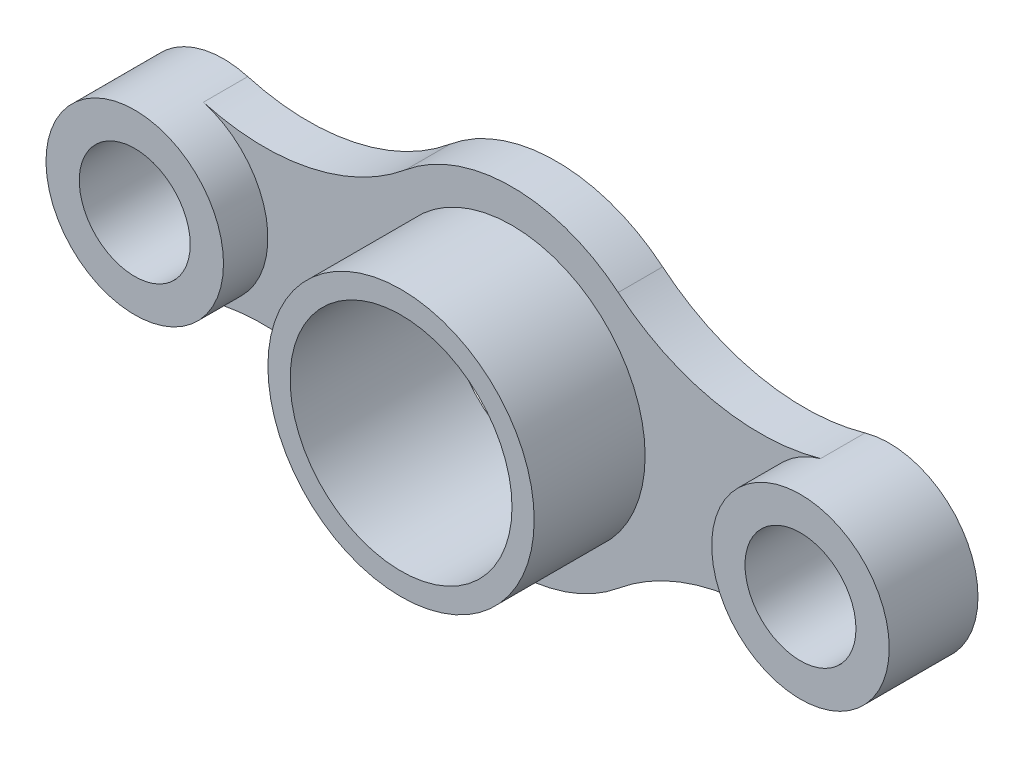
ISO-10303-21;
HEADER;
FILE_DESCRIPTION(('STEP AP214'),'2;1');
FILE_NAME('part.step','',(''),(''),'','','');
FILE_SCHEMA(('AUTOMOTIVE_DESIGN { 1 0 10303 214 1 1 1 1 }'));
ENDSEC;
DATA;
#1=APPLICATION_CONTEXT('core data for automotive mechanical design processes');
#2=APPLICATION_PROTOCOL_DEFINITION('international standard','automotive_design',2000,#1);
#3=PRODUCT_CONTEXT('',#1,'mechanical');
#4=PRODUCT('Part','Part','',(#3));
#5=PRODUCT_RELATED_PRODUCT_CATEGORY('part','',(#4));
#6=PRODUCT_DEFINITION_FORMATION('','',#4);
#7=PRODUCT_DEFINITION_CONTEXT('part definition',#1,'design');
#8=PRODUCT_DEFINITION('design','',#6,#7);
#9=PRODUCT_DEFINITION_SHAPE('','',#8);
#10=(LENGTH_UNIT() NAMED_UNIT(*) SI_UNIT(.MILLI.,.METRE.));
#11=(NAMED_UNIT(*) PLANE_ANGLE_UNIT() SI_UNIT($,.RADIAN.));
#12=(NAMED_UNIT(*) SI_UNIT($,.STERADIAN.) SOLID_ANGLE_UNIT());
#13=UNCERTAINTY_MEASURE_WITH_UNIT(LENGTH_MEASURE(1.E-05),#10,'distance_accuracy_value','');
#14=(GEOMETRIC_REPRESENTATION_CONTEXT(3) GLOBAL_UNCERTAINTY_ASSIGNED_CONTEXT((#13)) GLOBAL_UNIT_ASSIGNED_CONTEXT((#10,
#11,#12)) REPRESENTATION_CONTEXT('',''));
#15=CARTESIAN_POINT('',(0.,0.,0.));
#16=DIRECTION('',(0.,0.,1.));
#17=DIRECTION('',(1.,0.,0.));
#18=AXIS2_PLACEMENT_3D('',#15,#16,#17);
#19=CARTESIAN_POINT('',(111.75,134.673447642807,20.));
#20=DIRECTION('',(0.,0.,-1.));
#21=DIRECTION('',(-1.,0.,0.));
#22=AXIS2_PLACEMENT_3D('',#19,#20,#21);
#23=CYLINDRICAL_SURFACE('',#22,100.);
#24=CARTESIAN_POINT('',(111.75,134.673447642807,0.));
#25=DIRECTION('',(0.,0.,1.));
#26=DIRECTION('',(1.,0.,0.));
#27=AXIS2_PLACEMENT_3D('',#24,#25,#26);
#28=CIRCLE('',#27,100.);
#29=CARTESIAN_POINT('',(139.071428571429,38.478127897945,0.));
#30=VERTEX_POINT('',#29);
#31=CARTESIAN_POINT('',(47.8928571428572,57.7171918469175,0.));
#32=VERTEX_POINT('',#31);
#33=EDGE_CURVE('E129',#30,#32,#28,.F.);
#34=ORIENTED_EDGE('',*,*,#33,.T.);
#35=DIRECTION('',(0.,0.,-1.));
#36=VECTOR('',#35,1.);
#37=CARTESIAN_POINT('',(47.8928571428572,57.7171918469175,20.));
#38=LINE('',#37,#36);
#39=CARTESIAN_POINT('',(47.8928571428572,57.7171918469175,20.));
#40=VERTEX_POINT('',#39);
#41=EDGE_CURVE('E11',#40,#32,#38,.T.);
#42=ORIENTED_EDGE('',*,*,#41,.F.);
#43=CARTESIAN_POINT('',(111.75,134.673447642807,20.));
#44=DIRECTION('',(0.,0.,1.));
#45=DIRECTION('',(1.,0.,0.));
#46=AXIS2_PLACEMENT_3D('',#43,#44,#45);
#47=CIRCLE('',#46,100.);
#48=CARTESIAN_POINT('',(139.071428571429,38.478127897945,20.));
#49=VERTEX_POINT('',#48);
#50=EDGE_CURVE('E198',#49,#40,#47,.F.);
#51=ORIENTED_EDGE('',*,*,#50,.F.);
#52=DIRECTION('',(0.,0.,-1.));
#53=VECTOR('',#52,1.);
#54=CARTESIAN_POINT('',(139.071428571429,38.478127897945,20.));
#55=LINE('',#54,#53);
#56=EDGE_CURVE('E125',#49,#30,#55,.T.);
#57=ORIENTED_EDGE('',*,*,#56,.T.);
#58=EDGE_LOOP('',(#34,#42,#51,#57));
#59=FACE_BOUND('',#58,.T.);
#60=ADVANCED_FACE('F41',(#59),#23,.F.);
#61=CARTESIAN_POINT('',(0.,0.,20.));
#62=DIRECTION('',(0.,0.,-1.));
#63=DIRECTION('',(-1.,0.,0.));
#64=AXIS2_PLACEMENT_3D('',#61,#62,#63);
#65=CYLINDRICAL_SURFACE('',#64,75.);
#66=CARTESIAN_POINT('',(0.,0.,0.));
#67=DIRECTION('',(0.,0.,1.));
#68=DIRECTION('',(1.,0.,0.));
#69=AXIS2_PLACEMENT_3D('',#66,#67,#68);
#70=CIRCLE('',#69,75.);
#71=CARTESIAN_POINT('',(-47.8928571428572,57.7171918469175,0.));
#72=VERTEX_POINT('',#71);
#73=EDGE_CURVE('E133',#32,#72,#70,.T.);
#74=ORIENTED_EDGE('',*,*,#73,.T.);
#75=DIRECTION('',(0.,0.,-1.));
#76=VECTOR('',#75,1.);
#77=CARTESIAN_POINT('',(-47.8928571428572,57.7171918469175,20.));
#78=LINE('',#77,#76);
#79=CARTESIAN_POINT('',(-47.8928571428572,57.7171918469175,20.));
#80=VERTEX_POINT('',#79);
#81=EDGE_CURVE('E50',#80,#72,#78,.T.);
#82=ORIENTED_EDGE('',*,*,#81,.F.);
#83=CARTESIAN_POINT('',(0.,0.,20.));
#84=DIRECTION('',(0.,0.,1.));
#85=DIRECTION('',(1.,0.,0.));
#86=AXIS2_PLACEMENT_3D('',#83,#84,#85);
#87=CIRCLE('',#86,75.);
#88=EDGE_CURVE('E96',#40,#80,#87,.T.);
#89=ORIENTED_EDGE('',*,*,#88,.F.);
#90=ORIENTED_EDGE('',*,*,#41,.T.);
#91=EDGE_LOOP('',(#74,#82,#89,#90));
#92=FACE_BOUND('',#91,.T.);
#93=ADVANCED_FACE('F173',(#92),#65,.T.);
#94=CARTESIAN_POINT('',(-111.75,134.673447642807,20.));
#95=DIRECTION('',(0.,0.,-1.));
#96=DIRECTION('',(-1.,0.,0.));
#97=AXIS2_PLACEMENT_3D('',#94,#95,#96);
#98=CYLINDRICAL_SURFACE('',#97,100.);
#99=CARTESIAN_POINT('',(-111.75,134.673447642807,0.));
#100=DIRECTION('',(0.,0.,1.));
#101=DIRECTION('',(1.,0.,0.));
#102=AXIS2_PLACEMENT_3D('',#99,#100,#101);
#103=CIRCLE('',#102,100.);
#104=CARTESIAN_POINT('',(-139.071428571429,38.478127897945,0.));
#105=VERTEX_POINT('',#104);
#106=EDGE_CURVE('E138',#105,#72,#103,.T.);
#107=ORIENTED_EDGE('',*,*,#106,.F.);
#108=DIRECTION('',(0.,0.,-1.));
#109=VECTOR('',#108,1.);
#110=CARTESIAN_POINT('',(-139.071428571429,38.478127897945,20.));
#111=LINE('',#110,#109);
#112=CARTESIAN_POINT('',(-139.071428571429,38.478127897945,20.));
#113=VERTEX_POINT('',#112);
#114=EDGE_CURVE('E162',#113,#105,#111,.T.);
#115=ORIENTED_EDGE('',*,*,#114,.F.);
#116=CARTESIAN_POINT('',(-111.75,134.673447642807,20.));
#117=DIRECTION('',(0.,0.,1.));
#118=DIRECTION('',(1.,0.,0.));
#119=AXIS2_PLACEMENT_3D('',#116,#117,#118);
#120=CIRCLE('',#119,100.);
#121=EDGE_CURVE('E172',#113,#80,#120,.T.);
#122=ORIENTED_EDGE('',*,*,#121,.T.);
#123=ORIENTED_EDGE('',*,*,#81,.T.);
#124=EDGE_LOOP('',(#107,#115,#122,#123));
#125=FACE_BOUND('',#124,.T.);
#126=ADVANCED_FACE('F169',(#125),#98,.F.);
#127=CARTESIAN_POINT('',(-111.75,-134.673447642807,20.));
#128=DIRECTION('',(0.,0.,-1.));
#129=DIRECTION('',(-1.,0.,0.));
#130=AXIS2_PLACEMENT_3D('',#127,#128,#129);
#131=CYLINDRICAL_SURFACE('',#130,100.);
#132=CARTESIAN_POINT('',(-111.75,-134.673447642807,0.));
#133=DIRECTION('',(0.,0.,1.));
#134=DIRECTION('',(1.,0.,0.));
#135=AXIS2_PLACEMENT_3D('',#132,#133,#134);
#136=CIRCLE('',#135,100.);
#137=CARTESIAN_POINT('',(-47.8928571428571,-57.7171918469175,0.));
#138=VERTEX_POINT('',#137);
#139=CARTESIAN_POINT('',(-139.071428571429,-38.478127897945,0.));
#140=VERTEX_POINT('',#139);
#141=EDGE_CURVE('E142',#138,#140,#136,.T.);
#142=ORIENTED_EDGE('',*,*,#141,.F.);
#143=DIRECTION('',(0.,0.,-1.));
#144=VECTOR('',#143,1.);
#145=CARTESIAN_POINT('',(-47.8928571428571,-57.7171918469175,20.));
#146=LINE('',#145,#144);
#147=CARTESIAN_POINT('',(-47.8928571428571,-57.7171918469175,20.));
#148=VERTEX_POINT('',#147);
#149=EDGE_CURVE('E118',#148,#138,#146,.T.);
#150=ORIENTED_EDGE('',*,*,#149,.F.);
#151=CARTESIAN_POINT('',(-111.75,-134.673447642807,20.));
#152=DIRECTION('',(0.,0.,1.));
#153=DIRECTION('',(1.,0.,0.));
#154=AXIS2_PLACEMENT_3D('',#151,#152,#153);
#155=CIRCLE('',#154,100.);
#156=CARTESIAN_POINT('',(-139.071428571429,-38.478127897945,20.));
#157=VERTEX_POINT('',#156);
#158=EDGE_CURVE('E112',#148,#157,#155,.T.);
#159=ORIENTED_EDGE('',*,*,#158,.T.);
#160=DIRECTION('',(0.,0.,-1.));
#161=VECTOR('',#160,1.);
#162=CARTESIAN_POINT('',(-139.071428571429,-38.478127897945,20.));
#163=LINE('',#162,#161);
#164=EDGE_CURVE('E158',#157,#140,#163,.T.);
#165=ORIENTED_EDGE('',*,*,#164,.T.);
#166=EDGE_LOOP('',(#142,#150,#159,#165));
#167=FACE_BOUND('',#166,.T.);
#168=ADVANCED_FACE('F203',(#167),#131,.F.);
#169=CARTESIAN_POINT('',(0.,0.,20.));
#170=DIRECTION('',(0.,0.,-1.));
#171=DIRECTION('',(-1.,0.,0.));
#172=AXIS2_PLACEMENT_3D('',#169,#170,#171);
#173=CYLINDRICAL_SURFACE('',#172,75.);
#174=CARTESIAN_POINT('',(0.,0.,0.));
#175=DIRECTION('',(0.,0.,1.));
#176=DIRECTION('',(1.,0.,0.));
#177=AXIS2_PLACEMENT_3D('',#174,#175,#176);
#178=CIRCLE('',#177,75.);
#179=CARTESIAN_POINT('',(47.8928571428572,-57.7171918469175,0.));
#180=VERTEX_POINT('',#179);
#181=EDGE_CURVE('E81',#138,#180,#178,.T.);
#182=ORIENTED_EDGE('',*,*,#181,.T.);
#183=DIRECTION('',(0.,0.,-1.));
#184=VECTOR('',#183,1.);
#185=CARTESIAN_POINT('',(47.8928571428572,-57.7171918469175,20.));
#186=LINE('',#185,#184);
#187=CARTESIAN_POINT('',(47.8928571428572,-57.7171918469175,20.));
#188=VERTEX_POINT('',#187);
#189=EDGE_CURVE('E115',#188,#180,#186,.T.);
#190=ORIENTED_EDGE('',*,*,#189,.F.);
#191=CARTESIAN_POINT('',(0.,0.,20.));
#192=DIRECTION('',(0.,0.,1.));
#193=DIRECTION('',(1.,0.,0.));
#194=AXIS2_PLACEMENT_3D('',#191,#192,#193);
#195=CIRCLE('',#194,75.);
#196=EDGE_CURVE('E106',#148,#188,#195,.T.);
#197=ORIENTED_EDGE('',*,*,#196,.F.);
#198=ORIENTED_EDGE('',*,*,#149,.T.);
#199=EDGE_LOOP('',(#182,#190,#197,#198));
#200=FACE_BOUND('',#199,.T.);
#201=ADVANCED_FACE('F116',(#200),#173,.T.);
#202=CARTESIAN_POINT('',(111.75,-134.673447642807,20.));
#203=DIRECTION('',(0.,0.,-1.));
#204=DIRECTION('',(-1.,0.,0.));
#205=AXIS2_PLACEMENT_3D('',#202,#203,#204);
#206=CYLINDRICAL_SURFACE('',#205,100.);
#207=CARTESIAN_POINT('',(111.75,-134.673447642807,0.));
#208=DIRECTION('',(0.,0.,1.));
#209=DIRECTION('',(1.,0.,0.));
#210=AXIS2_PLACEMENT_3D('',#207,#208,#209);
#211=CIRCLE('',#210,100.);
#212=CARTESIAN_POINT('',(139.071428571429,-38.478127897945,0.));
#213=VERTEX_POINT('',#212);
#214=EDGE_CURVE('E88',#180,#213,#211,.F.);
#215=ORIENTED_EDGE('',*,*,#214,.T.);
#216=DIRECTION('',(0.,0.,-1.));
#217=VECTOR('',#216,1.);
#218=CARTESIAN_POINT('',(139.071428571429,-38.478127897945,20.));
#219=LINE('',#218,#217);
#220=CARTESIAN_POINT('',(139.071428571429,-38.478127897945,20.));
#221=VERTEX_POINT('',#220);
#222=EDGE_CURVE('E119',#221,#213,#219,.T.);
#223=ORIENTED_EDGE('',*,*,#222,.F.);
#224=CARTESIAN_POINT('',(111.75,-134.673447642807,20.));
#225=DIRECTION('',(0.,0.,1.));
#226=DIRECTION('',(1.,0.,0.));
#227=AXIS2_PLACEMENT_3D('',#224,#225,#226);
#228=CIRCLE('',#227,100.);
#229=EDGE_CURVE('E109',#188,#221,#228,.F.);
#230=ORIENTED_EDGE('',*,*,#229,.F.);
#231=ORIENTED_EDGE('',*,*,#189,.T.);
#232=EDGE_LOOP('',(#215,#223,#230,#231));
#233=FACE_BOUND('',#232,.T.);
#234=ADVANCED_FACE('F121',(#233),#206,.F.);
#235=CARTESIAN_POINT('',(0.,0.,20.));
#236=DIRECTION('',(0.,0.,1.));
#237=DIRECTION('',(1.,0.,0.));
#238=AXIS2_PLACEMENT_3D('',#235,#236,#237);
#239=PLANE('',#238);
#240=CARTESIAN_POINT('',(0.,0.,20.));
#241=DIRECTION('',(0.,0.,1.));
#242=DIRECTION('',(1.,0.,0.));
#243=AXIS2_PLACEMENT_3D('',#240,#241,#242);
#244=CIRCLE('',#243,60.);
#245=CARTESIAN_POINT('',(60.,0.,20.));
#246=VERTEX_POINT('',#245);
#247=EDGE_CURVE('E150',#246,#246,#244,.T.);
#248=ORIENTED_EDGE('',*,*,#247,.F.);
#249=EDGE_LOOP('',(#248));
#250=FACE_BOUND('',#249,.T.);
#251=ORIENTED_EDGE('',*,*,#50,.T.);
#252=ORIENTED_EDGE('',*,*,#88,.T.);
#253=ORIENTED_EDGE('',*,*,#121,.F.);
#254=CARTESIAN_POINT('',(-150.,0.,20.));
#255=DIRECTION('',(0.,0.,1.));
#256=DIRECTION('',(1.,0.,0.));
#257=AXIS2_PLACEMENT_3D('',#254,#255,#256);
#258=CIRCLE('',#257,40.);
#259=EDGE_CURVE('E192',#157,#113,#258,.T.);
#260=ORIENTED_EDGE('',*,*,#259,.F.);
#261=ORIENTED_EDGE('',*,*,#158,.F.);
#262=ORIENTED_EDGE('',*,*,#196,.T.);
#263=ORIENTED_EDGE('',*,*,#229,.T.);
#264=CARTESIAN_POINT('',(150.,0.,20.));
#265=DIRECTION('',(0.,0.,1.));
#266=DIRECTION('',(1.,0.,0.));
#267=AXIS2_PLACEMENT_3D('',#264,#265,#266);
#268=CIRCLE('',#267,40.);
#269=EDGE_CURVE('E58',#221,#49,#268,.F.);
#270=ORIENTED_EDGE('',*,*,#269,.T.);
#271=EDGE_LOOP('',(#251,#252,#253,#260,#261,#262,#263,#270));
#272=FACE_BOUND('',#271,.T.);
#273=ADVANCED_FACE('F107',(#250,#272),#239,.T.);
#274=CARTESIAN_POINT('',(0.,0.,0.));
#275=DIRECTION('',(0.,0.,1.));
#276=DIRECTION('',(1.,0.,0.));
#277=AXIS2_PLACEMENT_3D('',#274,#275,#276);
#278=PLANE('',#277);
#279=ORIENTED_EDGE('',*,*,#33,.F.);
#280=CARTESIAN_POINT('',(150.,0.,0.));
#281=DIRECTION('',(0.,0.,1.));
#282=DIRECTION('',(1.,0.,0.));
#283=AXIS2_PLACEMENT_3D('',#280,#281,#282);
#284=CIRCLE('',#283,40.);
#285=EDGE_CURVE('E206',#30,#213,#284,.F.);
#286=ORIENTED_EDGE('',*,*,#285,.T.);
#287=ORIENTED_EDGE('',*,*,#214,.F.);
#288=ORIENTED_EDGE('',*,*,#181,.F.);
#289=ORIENTED_EDGE('',*,*,#141,.T.);
#290=CARTESIAN_POINT('',(-150.,0.,0.));
#291=DIRECTION('',(0.,0.,1.));
#292=DIRECTION('',(1.,0.,0.));
#293=AXIS2_PLACEMENT_3D('',#290,#291,#292);
#294=CIRCLE('',#293,40.);
#295=EDGE_CURVE('E180',#105,#140,#294,.T.);
#296=ORIENTED_EDGE('',*,*,#295,.F.);
#297=ORIENTED_EDGE('',*,*,#106,.T.);
#298=ORIENTED_EDGE('',*,*,#73,.F.);
#299=EDGE_LOOP('',(#279,#286,#287,#288,#289,#296,#297,#298));
#300=FACE_BOUND('',#299,.T.);
#301=CARTESIAN_POINT('',(-150.,0.,0.));
#302=DIRECTION('',(0.,0.,1.));
#303=DIRECTION('',(1.,0.,0.));
#304=AXIS2_PLACEMENT_3D('',#301,#302,#303);
#305=CIRCLE('',#304,25.);
#306=CARTESIAN_POINT('',(-125.,0.,0.));
#307=VERTEX_POINT('',#306);
#308=EDGE_CURVE('E187',#307,#307,#305,.T.);
#309=ORIENTED_EDGE('',*,*,#308,.T.);
#310=EDGE_LOOP('',(#309));
#311=FACE_BOUND('',#310,.T.);
#312=CARTESIAN_POINT('',(150.,0.,0.));
#313=DIRECTION('',(0.,0.,1.));
#314=DIRECTION('',(1.,0.,0.));
#315=AXIS2_PLACEMENT_3D('',#312,#313,#314);
#316=CIRCLE('',#315,25.);
#317=CARTESIAN_POINT('',(175.,0.,0.));
#318=VERTEX_POINT('',#317);
#319=EDGE_CURVE('E211',#318,#318,#316,.F.);
#320=ORIENTED_EDGE('',*,*,#319,.F.);
#321=EDGE_LOOP('',(#320));
#322=FACE_BOUND('',#321,.T.);
#323=CARTESIAN_POINT('',(0.,0.,0.));
#324=DIRECTION('',(0.,0.,1.));
#325=DIRECTION('',(1.,0.,0.));
#326=AXIS2_PLACEMENT_3D('',#323,#324,#325);
#327=CIRCLE('',#326,50.);
#328=CARTESIAN_POINT('',(50.,0.,0.));
#329=VERTEX_POINT('',#328);
#330=EDGE_CURVE('E361',#329,#329,#327,.T.);
#331=ORIENTED_EDGE('',*,*,#330,.T.);
#332=EDGE_LOOP('',(#331));
#333=FACE_BOUND('',#332,.T.);
#334=ADVANCED_FACE('F177',(#300,#311,#322,#333),#278,.F.);
#335=CARTESIAN_POINT('',(-150.,0.,40.));
#336=DIRECTION('',(0.,0.,-1.));
#337=DIRECTION('',(-1.,0.,0.));
#338=AXIS2_PLACEMENT_3D('',#335,#336,#337);
#339=CYLINDRICAL_SURFACE('',#338,40.);
#340=CARTESIAN_POINT('',(-150.,0.,40.));
#341=DIRECTION('',(0.,0.,1.));
#342=DIRECTION('',(1.,0.,0.));
#343=AXIS2_PLACEMENT_3D('',#340,#341,#342);
#344=CIRCLE('',#343,40.);
#345=CARTESIAN_POINT('',(-110.,0.,40.));
#346=VERTEX_POINT('',#345);
#347=EDGE_CURVE('E134',#346,#346,#344,.T.);
#348=ORIENTED_EDGE('',*,*,#347,.F.);
#349=EDGE_LOOP('',(#348));
#350=FACE_BOUND('',#349,.T.);
#351=ORIENTED_EDGE('',*,*,#259,.T.);
#352=ORIENTED_EDGE('',*,*,#114,.T.);
#353=ORIENTED_EDGE('',*,*,#295,.T.);
#354=ORIENTED_EDGE('',*,*,#164,.F.);
#355=EDGE_LOOP('',(#351,#352,#353,#354));
#356=FACE_BOUND('',#355,.T.);
#357=ADVANCED_FACE('F190',(#350,#356),#339,.T.);
#358=CARTESIAN_POINT('',(-150.,0.,40.));
#359=DIRECTION('',(0.,0.,-1.));
#360=DIRECTION('',(-1.,0.,0.));
#361=AXIS2_PLACEMENT_3D('',#358,#359,#360);
#362=CYLINDRICAL_SURFACE('',#361,25.);
#363=CARTESIAN_POINT('',(-150.,0.,40.));
#364=DIRECTION('',(0.,0.,1.));
#365=DIRECTION('',(1.,0.,0.));
#366=AXIS2_PLACEMENT_3D('',#363,#364,#365);
#367=CIRCLE('',#366,25.);
#368=CARTESIAN_POINT('',(-125.,0.,40.));
#369=VERTEX_POINT('',#368);
#370=EDGE_CURVE('E186',#369,#369,#367,.T.);
#371=ORIENTED_EDGE('',*,*,#370,.T.);
#372=EDGE_LOOP('',(#371));
#373=FACE_BOUND('',#372,.T.);
#374=ORIENTED_EDGE('',*,*,#308,.F.);
#375=EDGE_LOOP('',(#374));
#376=FACE_BOUND('',#375,.T.);
#377=ADVANCED_FACE('F253',(#373,#376),#362,.F.);
#378=CARTESIAN_POINT('',(0.,0.,40.));
#379=DIRECTION('',(0.,0.,1.));
#380=DIRECTION('',(1.,0.,0.));
#381=AXIS2_PLACEMENT_3D('',#378,#379,#380);
#382=PLANE('',#381);
#383=ORIENTED_EDGE('',*,*,#370,.F.);
#384=EDGE_LOOP('',(#383));
#385=FACE_BOUND('',#384,.T.);
#386=ORIENTED_EDGE('',*,*,#347,.T.);
#387=EDGE_LOOP('',(#386));
#388=FACE_BOUND('',#387,.T.);
#389=ADVANCED_FACE('F243',(#385,#388),#382,.T.);
#390=CARTESIAN_POINT('',(150.,0.,40.));
#391=DIRECTION('',(0.,0.,-1.));
#392=DIRECTION('',(-1.,0.,0.));
#393=AXIS2_PLACEMENT_3D('',#390,#391,#392);
#394=CYLINDRICAL_SURFACE('',#393,40.);
#395=CARTESIAN_POINT('',(150.,0.,40.));
#396=DIRECTION('',(0.,0.,1.));
#397=DIRECTION('',(1.,0.,0.));
#398=AXIS2_PLACEMENT_3D('',#395,#396,#397);
#399=CIRCLE('',#398,40.);
#400=CARTESIAN_POINT('',(190.,0.,40.));
#401=VERTEX_POINT('',#400);
#402=EDGE_CURVE('E217',#401,#401,#399,.F.);
#403=ORIENTED_EDGE('',*,*,#402,.T.);
#404=EDGE_LOOP('',(#403));
#405=FACE_BOUND('',#404,.T.);
#406=ORIENTED_EDGE('',*,*,#56,.F.);
#407=ORIENTED_EDGE('',*,*,#269,.F.);
#408=ORIENTED_EDGE('',*,*,#222,.T.);
#409=ORIENTED_EDGE('',*,*,#285,.F.);
#410=EDGE_LOOP('',(#406,#407,#408,#409));
#411=FACE_BOUND('',#410,.T.);
#412=ADVANCED_FACE('F240',(#405,#411),#394,.T.);
#413=CARTESIAN_POINT('',(150.,0.,40.));
#414=DIRECTION('',(0.,0.,-1.));
#415=DIRECTION('',(-1.,0.,0.));
#416=AXIS2_PLACEMENT_3D('',#413,#414,#415);
#417=CYLINDRICAL_SURFACE('',#416,25.);
#418=CARTESIAN_POINT('',(150.,0.,40.));
#419=DIRECTION('',(0.,0.,1.));
#420=DIRECTION('',(1.,0.,0.));
#421=AXIS2_PLACEMENT_3D('',#418,#419,#420);
#422=CIRCLE('',#421,25.);
#423=CARTESIAN_POINT('',(175.,0.,40.));
#424=VERTEX_POINT('',#423);
#425=EDGE_CURVE('E223',#424,#424,#422,.F.);
#426=ORIENTED_EDGE('',*,*,#425,.F.);
#427=EDGE_LOOP('',(#426));
#428=FACE_BOUND('',#427,.T.);
#429=ORIENTED_EDGE('',*,*,#319,.T.);
#430=EDGE_LOOP('',(#429));
#431=FACE_BOUND('',#430,.T.);
#432=ADVANCED_FACE('F242',(#428,#431),#417,.F.);
#433=CARTESIAN_POINT('',(0.,0.,40.));
#434=DIRECTION('',(0.,0.,1.));
#435=DIRECTION('',(1.,0.,0.));
#436=AXIS2_PLACEMENT_3D('',#433,#434,#435);
#437=PLANE('',#436);
#438=ORIENTED_EDGE('',*,*,#402,.F.);
#439=EDGE_LOOP('',(#438));
#440=FACE_BOUND('',#439,.T.);
#441=ORIENTED_EDGE('',*,*,#425,.T.);
#442=EDGE_LOOP('',(#441));
#443=FACE_BOUND('',#442,.T.);
#444=ADVANCED_FACE('F250',(#440,#443),#437,.T.);
#445=CARTESIAN_POINT('',(0.,0.,70.));
#446=DIRECTION('',(0.,0.,-1.));
#447=DIRECTION('',(-1.,0.,0.));
#448=AXIS2_PLACEMENT_3D('',#445,#446,#447);
#449=CYLINDRICAL_SURFACE('',#448,50.);
#450=CARTESIAN_POINT('',(0.,0.,70.));
#451=DIRECTION('',(0.,0.,1.));
#452=DIRECTION('',(1.,0.,0.));
#453=AXIS2_PLACEMENT_3D('',#450,#451,#452);
#454=CIRCLE('',#453,50.);
#455=CARTESIAN_POINT('',(50.,0.,70.));
#456=VERTEX_POINT('',#455);
#457=EDGE_CURVE('E220',#456,#456,#454,.T.);
#458=ORIENTED_EDGE('',*,*,#457,.T.);
#459=EDGE_LOOP('',(#458));
#460=FACE_BOUND('',#459,.T.);
#461=ORIENTED_EDGE('',*,*,#330,.F.);
#462=EDGE_LOOP('',(#461));
#463=FACE_BOUND('',#462,.T.);
#464=ADVANCED_FACE('F315',(#460,#463),#449,.F.);
#465=CARTESIAN_POINT('',(0.,0.,70.));
#466=DIRECTION('',(0.,0.,-1.));
#467=DIRECTION('',(-1.,0.,0.));
#468=AXIS2_PLACEMENT_3D('',#465,#466,#467);
#469=CYLINDRICAL_SURFACE('',#468,60.);
#470=ORIENTED_EDGE('',*,*,#247,.T.);
#471=EDGE_LOOP('',(#470));
#472=FACE_BOUND('',#471,.T.);
#473=CARTESIAN_POINT('',(0.,0.,70.));
#474=DIRECTION('',(0.,0.,1.));
#475=DIRECTION('',(1.,0.,0.));
#476=AXIS2_PLACEMENT_3D('',#473,#474,#475);
#477=CIRCLE('',#476,60.);
#478=CARTESIAN_POINT('',(60.,0.,70.));
#479=VERTEX_POINT('',#478);
#480=EDGE_CURVE('E212',#479,#479,#477,.T.);
#481=ORIENTED_EDGE('',*,*,#480,.F.);
#482=EDGE_LOOP('',(#481));
#483=FACE_BOUND('',#482,.T.);
#484=ADVANCED_FACE('F331',(#472,#483),#469,.T.);
#485=CARTESIAN_POINT('',(0.,0.,70.));
#486=DIRECTION('',(0.,0.,1.));
#487=DIRECTION('',(1.,0.,0.));
#488=AXIS2_PLACEMENT_3D('',#485,#486,#487);
#489=PLANE('',#488);
#490=ORIENTED_EDGE('',*,*,#457,.F.);
#491=EDGE_LOOP('',(#490));
#492=FACE_BOUND('',#491,.T.);
#493=ORIENTED_EDGE('',*,*,#480,.T.);
#494=EDGE_LOOP('',(#493));
#495=FACE_BOUND('',#494,.T.);
#496=ADVANCED_FACE('F341',(#492,#495),#489,.T.);
#497=CLOSED_SHELL('',(#60,#93,#126,#168,#201,#234,#273,#334,#357,#377,#389,#412,#432,#444,#464,
#484,#496));
#498=MANIFOLD_SOLID_BREP('B2',#497);
#499=ADVANCED_BREP_SHAPE_REPRESENTATION('',(#18,#498),#14);
#500=SHAPE_DEFINITION_REPRESENTATION(#9,#499);
ENDSEC;
END-ISO-10303-21;
